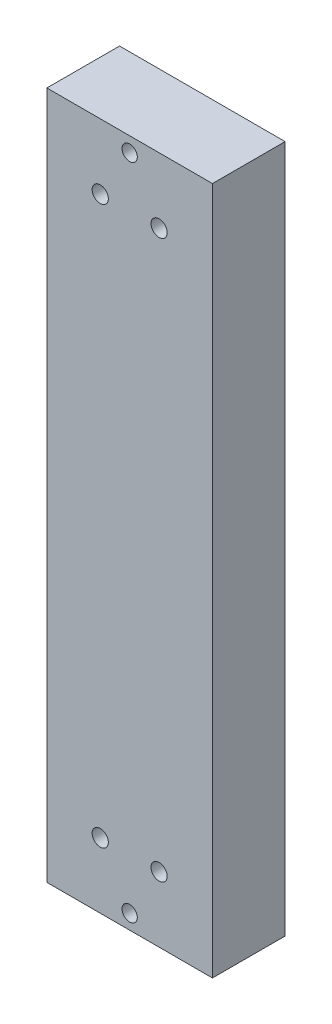
ISO-10303-21;
HEADER;
FILE_DESCRIPTION(('STEP AP214'),'2;1');
FILE_NAME('part.step','',(''),(''),'','','');
FILE_SCHEMA(('AUTOMOTIVE_DESIGN { 1 0 10303 214 1 1 1 1 }'));
ENDSEC;
DATA;
#1=APPLICATION_CONTEXT('core data for automotive mechanical design processes');
#2=APPLICATION_PROTOCOL_DEFINITION('international standard','automotive_design',2000,#1);
#3=PRODUCT_CONTEXT('',#1,'mechanical');
#4=PRODUCT('Part','Part','',(#3));
#5=PRODUCT_RELATED_PRODUCT_CATEGORY('part','',(#4));
#6=PRODUCT_DEFINITION_FORMATION('','',#4);
#7=PRODUCT_DEFINITION_CONTEXT('part definition',#1,'design');
#8=PRODUCT_DEFINITION('design','',#6,#7);
#9=PRODUCT_DEFINITION_SHAPE('','',#8);
#10=(LENGTH_UNIT() NAMED_UNIT(*) SI_UNIT(.MILLI.,.METRE.));
#11=(NAMED_UNIT(*) PLANE_ANGLE_UNIT() SI_UNIT($,.RADIAN.));
#12=(NAMED_UNIT(*) SI_UNIT($,.STERADIAN.) SOLID_ANGLE_UNIT());
#13=UNCERTAINTY_MEASURE_WITH_UNIT(LENGTH_MEASURE(1.E-05),#10,'distance_accuracy_value','');
#14=(GEOMETRIC_REPRESENTATION_CONTEXT(3) GLOBAL_UNCERTAINTY_ASSIGNED_CONTEXT((#13)) GLOBAL_UNIT_ASSIGNED_CONTEXT((#10,
#11,#12)) REPRESENTATION_CONTEXT('',''));
#15=CARTESIAN_POINT('',(0.,0.,0.));
#16=DIRECTION('',(0.,0.,1.));
#17=DIRECTION('',(1.,0.,0.));
#18=AXIS2_PLACEMENT_3D('',#15,#16,#17);
#19=CARTESIAN_POINT('',(0.,0.,0.));
#20=DIRECTION('',(0.,0.,1.));
#21=DIRECTION('',(1.,0.,0.));
#22=AXIS2_PLACEMENT_3D('',#19,#20,#21);
#23=PLANE('',#22);
#24=CARTESIAN_POINT('',(-2.92911864286199E-13,75.75,0.));
#25=DIRECTION('',(0.,0.,1.));
#26=DIRECTION('',(1.,0.,0.));
#27=AXIS2_PLACEMENT_3D('',#24,#25,#26);
#28=CIRCLE('',#27,2.19999999999999);
#29=CARTESIAN_POINT('',(2.1999999999997,75.75,0.));
#30=VERTEX_POINT('',#29);
#31=EDGE_CURVE('E294',#30,#30,#28,.T.);
#32=ORIENTED_EDGE('',*,*,#31,.T.);
#33=EDGE_LOOP('',(#32));
#34=FACE_BOUND('',#33,.T.);
#35=CARTESIAN_POINT('',(-2.75902098228347E-13,-75.75,0.));
#36=DIRECTION('',(0.,0.,1.));
#37=DIRECTION('',(1.,0.,0.));
#38=AXIS2_PLACEMENT_3D('',#35,#36,#37);
#39=CIRCLE('',#38,2.19999999999999);
#40=CARTESIAN_POINT('',(2.19999999999972,-75.75,0.));
#41=VERTEX_POINT('',#40);
#42=EDGE_CURVE('E282',#41,#41,#39,.T.);
#43=ORIENTED_EDGE('',*,*,#42,.T.);
#44=EDGE_LOOP('',(#43));
#45=FACE_BOUND('',#44,.T.);
#46=DIRECTION('',(1.,0.,0.));
#47=VECTOR('',#46,1.);
#48=CARTESIAN_POINT('',(0.,-85.5,0.));
#49=LINE('',#48,#47);
#50=CARTESIAN_POINT('',(-12.5,-85.5,0.));
#51=VERTEX_POINT('',#50);
#52=CARTESIAN_POINT('',(6.50000000000001,-85.5,0.));
#53=VERTEX_POINT('',#52);
#54=EDGE_CURVE('E140',#51,#53,#49,.T.);
#55=ORIENTED_EDGE('',*,*,#54,.F.);
#56=DIRECTION('',(0.,1.,0.));
#57=VECTOR('',#56,1.);
#58=CARTESIAN_POINT('',(-12.5,0.,0.));
#59=LINE('',#58,#57);
#60=CARTESIAN_POINT('',(-12.5,85.5,0.));
#61=VERTEX_POINT('',#60);
#62=EDGE_CURVE('E145',#51,#61,#59,.T.);
#63=ORIENTED_EDGE('',*,*,#62,.T.);
#64=DIRECTION('',(1.,0.,0.));
#65=VECTOR('',#64,1.);
#66=CARTESIAN_POINT('',(0.,85.5,0.));
#67=LINE('',#66,#65);
#68=CARTESIAN_POINT('',(6.50000000000001,85.5,0.));
#69=VERTEX_POINT('',#68);
#70=EDGE_CURVE('E245',#61,#69,#67,.T.);
#71=ORIENTED_EDGE('',*,*,#70,.T.);
#72=DIRECTION('',(0.,1.,0.));
#73=VECTOR('',#72,1.);
#74=CARTESIAN_POINT('',(6.50000000000001,0.,0.));
#75=LINE('',#74,#73);
#76=EDGE_CURVE('E223',#53,#69,#75,.T.);
#77=ORIENTED_EDGE('',*,*,#76,.F.);
#78=EDGE_LOOP('',(#55,#63,#71,#77));
#79=FACE_BOUND('',#78,.T.);
#80=ADVANCED_FACE('F125',(#34,#45,#79),#23,.F.);
#81=CARTESIAN_POINT('',(0.,0.,4.75));
#82=DIRECTION('',(0.,0.,1.));
#83=DIRECTION('',(1.,0.,0.));
#84=AXIS2_PLACEMENT_3D('',#81,#82,#83);
#85=PLANE('',#84);
#86=CARTESIAN_POINT('',(15.9999999999997,-75.75,4.75));
#87=DIRECTION('',(0.,0.,1.));
#88=DIRECTION('',(1.,0.,0.));
#89=AXIS2_PLACEMENT_3D('',#86,#87,#88);
#90=CIRCLE('',#89,2.2);
#91=CARTESIAN_POINT('',(18.1999999999997,-75.75,4.75));
#92=VERTEX_POINT('',#91);
#93=EDGE_CURVE('E279',#92,#92,#90,.T.);
#94=ORIENTED_EDGE('',*,*,#93,.F.);
#95=EDGE_LOOP('',(#94));
#96=FACE_BOUND('',#95,.T.);
#97=CARTESIAN_POINT('',(15.9999999999997,75.75,4.75));
#98=DIRECTION('',(0.,0.,1.));
#99=DIRECTION('',(1.,0.,0.));
#100=AXIS2_PLACEMENT_3D('',#97,#98,#99);
#101=CIRCLE('',#100,2.2);
#102=CARTESIAN_POINT('',(18.1999999999997,75.75,4.75));
#103=VERTEX_POINT('',#102);
#104=EDGE_CURVE('E291',#103,#103,#101,.T.);
#105=ORIENTED_EDGE('',*,*,#104,.F.);
#106=EDGE_LOOP('',(#105));
#107=FACE_BOUND('',#106,.T.);
#108=DIRECTION('',(1.,0.,0.));
#109=VECTOR('',#108,1.);
#110=CARTESIAN_POINT('',(-14.5,-93.5,4.75));
#111=LINE('',#110,#109);
#112=CARTESIAN_POINT('',(-14.5,-93.5,4.75));
#113=VERTEX_POINT('',#112);
#114=CARTESIAN_POINT('',(30.5,-93.5,4.75));
#115=VERTEX_POINT('',#114);
#116=EDGE_CURVE('E300',#113,#115,#111,.T.);
#117=ORIENTED_EDGE('',*,*,#116,.T.);
#118=DIRECTION('',(0.,1.,0.));
#119=VECTOR('',#118,1.);
#120=CARTESIAN_POINT('',(30.5,-93.5,4.75));
#121=LINE('',#120,#119);
#122=CARTESIAN_POINT('',(30.5,93.5,4.75));
#123=VERTEX_POINT('',#122);
#124=EDGE_CURVE('E305',#115,#123,#121,.T.);
#125=ORIENTED_EDGE('',*,*,#124,.T.);
#126=DIRECTION('',(1.,0.,0.));
#127=VECTOR('',#126,1.);
#128=CARTESIAN_POINT('',(-14.5,93.5,4.75));
#129=LINE('',#128,#127);
#130=CARTESIAN_POINT('',(-14.5,93.5,4.75));
#131=VERTEX_POINT('',#130);
#132=EDGE_CURVE('E307',#131,#123,#129,.T.);
#133=ORIENTED_EDGE('',*,*,#132,.F.);
#134=DIRECTION('',(0.,1.,0.));
#135=VECTOR('',#134,1.);
#136=CARTESIAN_POINT('',(-14.5,-93.5,4.75));
#137=LINE('',#136,#135);
#138=EDGE_CURVE('E310',#113,#131,#137,.T.);
#139=ORIENTED_EDGE('',*,*,#138,.F.);
#140=EDGE_LOOP('',(#117,#125,#133,#139));
#141=FACE_BOUND('',#140,.T.);
#142=CARTESIAN_POINT('',(-2.92911864286199E-13,75.75,4.75));
#143=DIRECTION('',(0.,0.,1.));
#144=DIRECTION('',(1.,0.,0.));
#145=AXIS2_PLACEMENT_3D('',#142,#143,#144);
#146=CIRCLE('',#145,2.19999999999999);
#147=CARTESIAN_POINT('',(2.1999999999997,75.75,4.75));
#148=VERTEX_POINT('',#147);
#149=EDGE_CURVE('E297',#148,#148,#146,.T.);
#150=ORIENTED_EDGE('',*,*,#149,.F.);
#151=EDGE_LOOP('',(#150));
#152=FACE_BOUND('',#151,.T.);
#153=CARTESIAN_POINT('',(-2.75902098228347E-13,-75.75,4.75));
#154=DIRECTION('',(0.,0.,1.));
#155=DIRECTION('',(1.,0.,0.));
#156=AXIS2_PLACEMENT_3D('',#153,#154,#155);
#157=CIRCLE('',#156,2.19999999999999);
#158=CARTESIAN_POINT('',(2.19999999999972,-75.75,4.75));
#159=VERTEX_POINT('',#158);
#160=EDGE_CURVE('E285',#159,#159,#157,.T.);
#161=ORIENTED_EDGE('',*,*,#160,.F.);
#162=EDGE_LOOP('',(#161));
#163=FACE_BOUND('',#162,.T.);
#164=CARTESIAN_POINT('',(7.99999999999997,89.5,4.75));
#165=DIRECTION('',(0.,0.,-1.));
#166=DIRECTION('',(-1.,0.,0.));
#167=AXIS2_PLACEMENT_3D('',#164,#165,#166);
#168=CIRCLE('',#167,2.075);
#169=CARTESIAN_POINT('',(5.92499999999998,89.5,4.75));
#170=VERTEX_POINT('',#169);
#171=EDGE_CURVE('E275',#170,#170,#168,.T.);
#172=ORIENTED_EDGE('',*,*,#171,.T.);
#173=EDGE_LOOP('',(#172));
#174=FACE_BOUND('',#173,.T.);
#175=CARTESIAN_POINT('',(8.,-89.5,4.75));
#176=DIRECTION('',(0.,0.,1.));
#177=DIRECTION('',(1.,0.,0.));
#178=AXIS2_PLACEMENT_3D('',#175,#176,#177);
#179=CIRCLE('',#178,2.075);
#180=CARTESIAN_POINT('',(10.075,-89.5,4.75));
#181=VERTEX_POINT('',#180);
#182=EDGE_CURVE('E271',#181,#181,#179,.T.);
#183=ORIENTED_EDGE('',*,*,#182,.F.);
#184=EDGE_LOOP('',(#183));
#185=FACE_BOUND('',#184,.T.);
#186=ADVANCED_FACE('F380',(#96,#107,#141,#152,#163,#174,#185),#85,.T.);
#187=CARTESIAN_POINT('',(9.5,-85.5,0.));
#188=VERTEX_POINT('',#187);
#189=CARTESIAN_POINT('',(28.5,-85.5,0.));
#190=VERTEX_POINT('',#189);
#191=EDGE_CURVE('E216',#188,#190,#49,.T.);
#192=ORIENTED_EDGE('',*,*,#191,.F.);
#193=DIRECTION('',(0.,1.,0.));
#194=VECTOR('',#193,1.);
#195=CARTESIAN_POINT('',(9.5,0.,0.));
#196=LINE('',#195,#194);
#197=CARTESIAN_POINT('',(9.5,85.5,0.));
#198=VERTEX_POINT('',#197);
#199=EDGE_CURVE('E239',#188,#198,#196,.T.);
#200=ORIENTED_EDGE('',*,*,#199,.T.);
#201=CARTESIAN_POINT('',(28.5,85.5,0.));
#202=VERTEX_POINT('',#201);
#203=EDGE_CURVE('E219',#198,#202,#67,.T.);
#204=ORIENTED_EDGE('',*,*,#203,.T.);
#205=DIRECTION('',(0.,1.,0.));
#206=VECTOR('',#205,1.);
#207=CARTESIAN_POINT('',(28.5,0.,0.));
#208=LINE('',#207,#206);
#209=EDGE_CURVE('E211',#190,#202,#208,.T.);
#210=ORIENTED_EDGE('',*,*,#209,.F.);
#211=EDGE_LOOP('',(#192,#200,#204,#210));
#212=FACE_BOUND('',#211,.T.);
#213=CARTESIAN_POINT('',(15.9999999999997,75.75,0.));
#214=DIRECTION('',(0.,0.,1.));
#215=DIRECTION('',(1.,0.,0.));
#216=AXIS2_PLACEMENT_3D('',#213,#214,#215);
#217=CIRCLE('',#216,2.2);
#218=CARTESIAN_POINT('',(18.1999999999997,75.75,0.));
#219=VERTEX_POINT('',#218);
#220=EDGE_CURVE('E288',#219,#219,#217,.T.);
#221=ORIENTED_EDGE('',*,*,#220,.T.);
#222=EDGE_LOOP('',(#221));
#223=FACE_BOUND('',#222,.T.);
#224=CARTESIAN_POINT('',(15.9999999999997,-75.75,0.));
#225=DIRECTION('',(0.,0.,1.));
#226=DIRECTION('',(1.,0.,0.));
#227=AXIS2_PLACEMENT_3D('',#224,#225,#226);
#228=CIRCLE('',#227,2.2);
#229=CARTESIAN_POINT('',(18.1999999999997,-75.75,0.));
#230=VERTEX_POINT('',#229);
#231=EDGE_CURVE('E278',#230,#230,#228,.T.);
#232=ORIENTED_EDGE('',*,*,#231,.T.);
#233=EDGE_LOOP('',(#232));
#234=FACE_BOUND('',#233,.T.);
#235=ADVANCED_FACE('F213',(#212,#223,#234),#23,.F.);
#236=CARTESIAN_POINT('',(-14.5,-93.5,4.75));
#237=DIRECTION('',(0.,1.,0.));
#238=DIRECTION('',(-1.,0.,0.));
#239=AXIS2_PLACEMENT_3D('',#236,#237,#238);
#240=PLANE('',#239);
#241=DIRECTION('',(0.,0.,-1.));
#242=VECTOR('',#241,1.);
#243=CARTESIAN_POINT('',(-14.5,-93.5,4.75));
#244=LINE('',#243,#242);
#245=CARTESIAN_POINT('',(-14.5,-93.5,-15.));
#246=VERTEX_POINT('',#245);
#247=EDGE_CURVE('E313',#113,#246,#244,.T.);
#248=ORIENTED_EDGE('',*,*,#247,.T.);
#249=DIRECTION('',(-1.,0.,0.));
#250=VECTOR('',#249,1.);
#251=CARTESIAN_POINT('',(0.,-93.5,-15.));
#252=LINE('',#251,#250);
#253=CARTESIAN_POINT('',(30.5,-93.5,-15.));
#254=VERTEX_POINT('',#253);
#255=EDGE_CURVE('E346',#254,#246,#252,.T.);
#256=ORIENTED_EDGE('',*,*,#255,.F.);
#257=DIRECTION('',(0.,0.,-1.));
#258=VECTOR('',#257,1.);
#259=CARTESIAN_POINT('',(30.5,-93.5,4.75));
#260=LINE('',#259,#258);
#261=EDGE_CURVE('E12',#115,#254,#260,.T.);
#262=ORIENTED_EDGE('',*,*,#261,.F.);
#263=ORIENTED_EDGE('',*,*,#116,.F.);
#264=EDGE_LOOP('',(#248,#256,#262,#263));
#265=FACE_BOUND('',#264,.T.);
#266=ADVANCED_FACE('F127',(#265),#240,.F.);
#267=CARTESIAN_POINT('',(30.5,-93.5,4.75));
#268=DIRECTION('',(-1.,0.,0.));
#269=DIRECTION('',(0.,-1.,0.));
#270=AXIS2_PLACEMENT_3D('',#267,#268,#269);
#271=PLANE('',#270);
#272=ORIENTED_EDGE('',*,*,#261,.T.);
#273=DIRECTION('',(0.,-1.,0.));
#274=VECTOR('',#273,1.);
#275=CARTESIAN_POINT('',(30.5,0.,-15.));
#276=LINE('',#275,#274);
#277=CARTESIAN_POINT('',(30.5,93.5,-15.));
#278=VERTEX_POINT('',#277);
#279=EDGE_CURVE('E331',#278,#254,#276,.T.);
#280=ORIENTED_EDGE('',*,*,#279,.F.);
#281=DIRECTION('',(0.,0.,-1.));
#282=VECTOR('',#281,1.);
#283=CARTESIAN_POINT('',(30.5,93.5,4.75));
#284=LINE('',#283,#282);
#285=EDGE_CURVE('E133',#123,#278,#284,.T.);
#286=ORIENTED_EDGE('',*,*,#285,.F.);
#287=ORIENTED_EDGE('',*,*,#124,.F.);
#288=EDGE_LOOP('',(#272,#280,#286,#287));
#289=FACE_BOUND('',#288,.T.);
#290=ADVANCED_FACE('F336',(#289),#271,.F.);
#291=CARTESIAN_POINT('',(-14.5,93.5,4.75));
#292=DIRECTION('',(0.,1.,0.));
#293=DIRECTION('',(-1.,0.,0.));
#294=AXIS2_PLACEMENT_3D('',#291,#292,#293);
#295=PLANE('',#294);
#296=ORIENTED_EDGE('',*,*,#285,.T.);
#297=DIRECTION('',(-1.,0.,0.));
#298=VECTOR('',#297,1.);
#299=CARTESIAN_POINT('',(0.,93.5,-15.));
#300=LINE('',#299,#298);
#301=CARTESIAN_POINT('',(-14.5,93.5,-15.));
#302=VERTEX_POINT('',#301);
#303=EDGE_CURVE('E321',#278,#302,#300,.T.);
#304=ORIENTED_EDGE('',*,*,#303,.T.);
#305=DIRECTION('',(0.,0.,-1.));
#306=VECTOR('',#305,1.);
#307=CARTESIAN_POINT('',(-14.5,93.5,4.75));
#308=LINE('',#307,#306);
#309=EDGE_CURVE('E315',#131,#302,#308,.T.);
#310=ORIENTED_EDGE('',*,*,#309,.F.);
#311=ORIENTED_EDGE('',*,*,#132,.T.);
#312=EDGE_LOOP('',(#296,#304,#310,#311));
#313=FACE_BOUND('',#312,.T.);
#314=ADVANCED_FACE('F320',(#313),#295,.T.);
#315=CARTESIAN_POINT('',(-14.5,-93.5,4.75));
#316=DIRECTION('',(-1.,0.,0.));
#317=DIRECTION('',(0.,-1.,0.));
#318=AXIS2_PLACEMENT_3D('',#315,#316,#317);
#319=PLANE('',#318);
#320=ORIENTED_EDGE('',*,*,#309,.T.);
#321=DIRECTION('',(0.,-1.,0.));
#322=VECTOR('',#321,1.);
#323=CARTESIAN_POINT('',(-14.5,0.,-15.));
#324=LINE('',#323,#322);
#325=EDGE_CURVE('E334',#302,#246,#324,.T.);
#326=ORIENTED_EDGE('',*,*,#325,.T.);
#327=ORIENTED_EDGE('',*,*,#247,.F.);
#328=ORIENTED_EDGE('',*,*,#138,.T.);
#329=EDGE_LOOP('',(#320,#326,#327,#328));
#330=FACE_BOUND('',#329,.T.);
#331=ADVANCED_FACE('F401',(#330),#319,.T.);
#332=CARTESIAN_POINT('',(-2.92911864286199E-13,75.75,4.75));
#333=DIRECTION('',(0.,0.,-1.));
#334=DIRECTION('',(-1.,0.,0.));
#335=AXIS2_PLACEMENT_3D('',#332,#333,#334);
#336=CYLINDRICAL_SURFACE('',#335,2.19999999999999);
#337=ORIENTED_EDGE('',*,*,#149,.T.);
#338=EDGE_LOOP('',(#337));
#339=FACE_BOUND('',#338,.T.);
#340=ORIENTED_EDGE('',*,*,#31,.F.);
#341=EDGE_LOOP('',(#340));
#342=FACE_BOUND('',#341,.T.);
#343=ADVANCED_FACE('F475',(#339,#342),#336,.F.);
#344=CARTESIAN_POINT('',(15.9999999999997,75.75,4.75));
#345=DIRECTION('',(0.,0.,-1.));
#346=DIRECTION('',(-1.,0.,0.));
#347=AXIS2_PLACEMENT_3D('',#344,#345,#346);
#348=CYLINDRICAL_SURFACE('',#347,2.2);
#349=ORIENTED_EDGE('',*,*,#104,.T.);
#350=EDGE_LOOP('',(#349));
#351=FACE_BOUND('',#350,.T.);
#352=ORIENTED_EDGE('',*,*,#220,.F.);
#353=EDGE_LOOP('',(#352));
#354=FACE_BOUND('',#353,.T.);
#355=ADVANCED_FACE('F522',(#351,#354),#348,.F.);
#356=CARTESIAN_POINT('',(-2.75902098228347E-13,-75.75,4.75));
#357=DIRECTION('',(0.,0.,-1.));
#358=DIRECTION('',(-1.,0.,0.));
#359=AXIS2_PLACEMENT_3D('',#356,#357,#358);
#360=CYLINDRICAL_SURFACE('',#359,2.19999999999999);
#361=ORIENTED_EDGE('',*,*,#160,.T.);
#362=EDGE_LOOP('',(#361));
#363=FACE_BOUND('',#362,.T.);
#364=ORIENTED_EDGE('',*,*,#42,.F.);
#365=EDGE_LOOP('',(#364));
#366=FACE_BOUND('',#365,.T.);
#367=ADVANCED_FACE('F375',(#363,#366),#360,.F.);
#368=CARTESIAN_POINT('',(15.9999999999997,-75.75,4.75));
#369=DIRECTION('',(0.,0.,-1.));
#370=DIRECTION('',(-1.,0.,0.));
#371=AXIS2_PLACEMENT_3D('',#368,#369,#370);
#372=CYLINDRICAL_SURFACE('',#371,2.2);
#373=ORIENTED_EDGE('',*,*,#93,.T.);
#374=EDGE_LOOP('',(#373));
#375=FACE_BOUND('',#374,.T.);
#376=ORIENTED_EDGE('',*,*,#231,.F.);
#377=EDGE_LOOP('',(#376));
#378=FACE_BOUND('',#377,.T.);
#379=ADVANCED_FACE('F365',(#375,#378),#372,.F.);
#380=CARTESIAN_POINT('',(7.99999999999997,89.5,4.75));
#381=DIRECTION('',(0.,0.,-1.));
#382=DIRECTION('',(-1.,0.,0.));
#383=AXIS2_PLACEMENT_3D('',#380,#381,#382);
#384=CYLINDRICAL_SURFACE('',#383,2.075);
#385=ORIENTED_EDGE('',*,*,#171,.F.);
#386=EDGE_LOOP('',(#385));
#387=FACE_BOUND('',#386,.T.);
#388=CARTESIAN_POINT('',(7.99999999999997,89.5,-15.));
#389=DIRECTION('',(0.,0.,1.));
#390=DIRECTION('',(0.,-1.,0.));
#391=AXIS2_PLACEMENT_3D('',#388,#389,#390);
#392=CIRCLE('',#391,2.075);
#393=CARTESIAN_POINT('',(7.99999999999997,87.425,-15.));
#394=VERTEX_POINT('',#393);
#395=EDGE_CURVE('E272',#394,#394,#392,.T.);
#396=ORIENTED_EDGE('',*,*,#395,.F.);
#397=EDGE_LOOP('',(#396));
#398=FACE_BOUND('',#397,.T.);
#399=ADVANCED_FACE('F362',(#387,#398),#384,.F.);
#400=CARTESIAN_POINT('',(8.,-89.5,4.75));
#401=DIRECTION('',(0.,0.,-1.));
#402=DIRECTION('',(-1.,0.,0.));
#403=AXIS2_PLACEMENT_3D('',#400,#401,#402);
#404=CYLINDRICAL_SURFACE('',#403,2.075);
#405=ORIENTED_EDGE('',*,*,#182,.T.);
#406=EDGE_LOOP('',(#405));
#407=FACE_BOUND('',#406,.T.);
#408=CARTESIAN_POINT('',(8.,-89.5,-15.));
#409=DIRECTION('',(0.,0.,1.));
#410=DIRECTION('',(0.,-1.,0.));
#411=AXIS2_PLACEMENT_3D('',#408,#409,#410);
#412=CIRCLE('',#411,2.075);
#413=CARTESIAN_POINT('',(8.,-91.575,-15.));
#414=VERTEX_POINT('',#413);
#415=EDGE_CURVE('E268',#414,#414,#412,.F.);
#416=ORIENTED_EDGE('',*,*,#415,.T.);
#417=EDGE_LOOP('',(#416));
#418=FACE_BOUND('',#417,.T.);
#419=ADVANCED_FACE('F364',(#407,#418),#404,.F.);
#420=CARTESIAN_POINT('',(0.,-85.5,-209.338243727034));
#421=DIRECTION('',(0.,-1.,0.));
#422=DIRECTION('',(0.,0.,-1.));
#423=AXIS2_PLACEMENT_3D('',#420,#421,#422);
#424=PLANE('',#423);
#425=DIRECTION('',(0.,0.,1.));
#426=VECTOR('',#425,1.);
#427=CARTESIAN_POINT('',(6.50000000000001,-85.5,-209.338243727034));
#428=LINE('',#427,#426);
#429=CARTESIAN_POINT('',(6.50000000000001,-85.5,-15.));
#430=VERTEX_POINT('',#429);
#431=EDGE_CURVE('E232',#430,#53,#428,.T.);
#432=ORIENTED_EDGE('',*,*,#431,.F.);
#433=DIRECTION('',(-1.,0.,0.));
#434=VECTOR('',#433,1.);
#435=CARTESIAN_POINT('',(0.,-85.5,-15.));
#436=LINE('',#435,#434);
#437=CARTESIAN_POINT('',(-12.5,-85.5,-15.));
#438=VERTEX_POINT('',#437);
#439=EDGE_CURVE('E257',#430,#438,#436,.T.);
#440=ORIENTED_EDGE('',*,*,#439,.T.);
#441=DIRECTION('',(0.,0.,1.));
#442=VECTOR('',#441,1.);
#443=CARTESIAN_POINT('',(-12.5,-85.5,-209.338243727034));
#444=LINE('',#443,#442);
#445=EDGE_CURVE('E260',#438,#51,#444,.T.);
#446=ORIENTED_EDGE('',*,*,#445,.T.);
#447=ORIENTED_EDGE('',*,*,#54,.T.);
#448=EDGE_LOOP('',(#432,#440,#446,#447));
#449=FACE_BOUND('',#448,.T.);
#450=ADVANCED_FACE('F372',(#449),#424,.F.);
#451=CARTESIAN_POINT('',(-12.5,0.,-209.338243727034));
#452=DIRECTION('',(1.,0.,0.));
#453=DIRECTION('',(0.,0.,-1.));
#454=AXIS2_PLACEMENT_3D('',#451,#452,#453);
#455=PLANE('',#454);
#456=DIRECTION('',(0.,-1.,0.));
#457=VECTOR('',#456,1.);
#458=CARTESIAN_POINT('',(-12.5,0.,-15.));
#459=LINE('',#458,#457);
#460=CARTESIAN_POINT('',(-12.5,85.5,-15.));
#461=VERTEX_POINT('',#460);
#462=EDGE_CURVE('E341',#461,#438,#459,.T.);
#463=ORIENTED_EDGE('',*,*,#462,.F.);
#464=DIRECTION('',(0.,0.,1.));
#465=VECTOR('',#464,1.);
#466=CARTESIAN_POINT('',(-12.5,85.5,-209.338243727034));
#467=LINE('',#466,#465);
#468=EDGE_CURVE('E258',#461,#61,#467,.T.);
#469=ORIENTED_EDGE('',*,*,#468,.T.);
#470=ORIENTED_EDGE('',*,*,#62,.F.);
#471=ORIENTED_EDGE('',*,*,#445,.F.);
#472=EDGE_LOOP('',(#463,#469,#470,#471));
#473=FACE_BOUND('',#472,.T.);
#474=ADVANCED_FACE('F425',(#473),#455,.T.);
#475=CARTESIAN_POINT('',(0.,85.5,-209.338243727034));
#476=DIRECTION('',(0.,-1.,0.));
#477=DIRECTION('',(0.,0.,-1.));
#478=AXIS2_PLACEMENT_3D('',#475,#476,#477);
#479=PLANE('',#478);
#480=DIRECTION('',(-1.,0.,0.));
#481=VECTOR('',#480,1.);
#482=CARTESIAN_POINT('',(0.,85.5,-15.));
#483=LINE('',#482,#481);
#484=CARTESIAN_POINT('',(6.50000000000001,85.5,-15.));
#485=VERTEX_POINT('',#484);
#486=EDGE_CURVE('E354',#485,#461,#483,.T.);
#487=ORIENTED_EDGE('',*,*,#486,.F.);
#488=DIRECTION('',(0.,0.,1.));
#489=VECTOR('',#488,1.);
#490=CARTESIAN_POINT('',(6.50000000000001,85.5,-209.338243727034));
#491=LINE('',#490,#489);
#492=EDGE_CURVE('E254',#485,#69,#491,.T.);
#493=ORIENTED_EDGE('',*,*,#492,.T.);
#494=ORIENTED_EDGE('',*,*,#70,.F.);
#495=ORIENTED_EDGE('',*,*,#468,.F.);
#496=EDGE_LOOP('',(#487,#493,#494,#495));
#497=FACE_BOUND('',#496,.T.);
#498=ADVANCED_FACE('F423',(#497),#479,.T.);
#499=CARTESIAN_POINT('',(6.50000000000001,0.,-209.338243727034));
#500=DIRECTION('',(1.,0.,0.));
#501=DIRECTION('',(0.,0.,-1.));
#502=AXIS2_PLACEMENT_3D('',#499,#500,#501);
#503=PLANE('',#502);
#504=ORIENTED_EDGE('',*,*,#492,.F.);
#505=DIRECTION('',(0.,-1.,0.));
#506=VECTOR('',#505,1.);
#507=CARTESIAN_POINT('',(6.50000000000001,0.,-15.));
#508=LINE('',#507,#506);
#509=EDGE_CURVE('E356',#485,#430,#508,.T.);
#510=ORIENTED_EDGE('',*,*,#509,.T.);
#511=ORIENTED_EDGE('',*,*,#431,.T.);
#512=ORIENTED_EDGE('',*,*,#76,.T.);
#513=EDGE_LOOP('',(#504,#510,#511,#512));
#514=FACE_BOUND('',#513,.T.);
#515=ADVANCED_FACE('F426',(#514),#503,.F.);
#516=CARTESIAN_POINT('',(9.5,0.,-209.338243727034));
#517=DIRECTION('',(1.,0.,0.));
#518=DIRECTION('',(0.,0.,-1.));
#519=AXIS2_PLACEMENT_3D('',#516,#517,#518);
#520=PLANE('',#519);
#521=DIRECTION('',(0.,-1.,0.));
#522=VECTOR('',#521,1.);
#523=CARTESIAN_POINT('',(9.5,0.,-15.));
#524=LINE('',#523,#522);
#525=CARTESIAN_POINT('',(9.5,85.5,-15.));
#526=VERTEX_POINT('',#525);
#527=CARTESIAN_POINT('',(9.5,-85.5,-15.));
#528=VERTEX_POINT('',#527);
#529=EDGE_CURVE('E338',#526,#528,#524,.T.);
#530=ORIENTED_EDGE('',*,*,#529,.F.);
#531=DIRECTION('',(0.,0.,1.));
#532=VECTOR('',#531,1.);
#533=CARTESIAN_POINT('',(9.5,85.5,-209.338243727034));
#534=LINE('',#533,#532);
#535=EDGE_CURVE('E264',#526,#198,#534,.T.);
#536=ORIENTED_EDGE('',*,*,#535,.T.);
#537=ORIENTED_EDGE('',*,*,#199,.F.);
#538=DIRECTION('',(0.,0.,1.));
#539=VECTOR('',#538,1.);
#540=CARTESIAN_POINT('',(9.5,-85.5,-209.338243727034));
#541=LINE('',#540,#539);
#542=EDGE_CURVE('E237',#528,#188,#541,.T.);
#543=ORIENTED_EDGE('',*,*,#542,.F.);
#544=EDGE_LOOP('',(#530,#536,#537,#543));
#545=FACE_BOUND('',#544,.T.);
#546=ADVANCED_FACE('F428',(#545),#520,.T.);
#547=DIRECTION('',(-1.,0.,0.));
#548=VECTOR('',#547,1.);
#549=CARTESIAN_POINT('',(0.,85.5,-15.));
#550=LINE('',#549,#548);
#551=CARTESIAN_POINT('',(28.5,85.5,-15.));
#552=VERTEX_POINT('',#551);
#553=EDGE_CURVE('E347',#552,#526,#550,.T.);
#554=ORIENTED_EDGE('',*,*,#553,.F.);
#555=DIRECTION('',(0.,0.,1.));
#556=VECTOR('',#555,1.);
#557=CARTESIAN_POINT('',(28.5,85.5,-209.338243727034));
#558=LINE('',#557,#556);
#559=EDGE_CURVE('E233',#552,#202,#558,.T.);
#560=ORIENTED_EDGE('',*,*,#559,.T.);
#561=ORIENTED_EDGE('',*,*,#203,.F.);
#562=ORIENTED_EDGE('',*,*,#535,.F.);
#563=EDGE_LOOP('',(#554,#560,#561,#562));
#564=FACE_BOUND('',#563,.T.);
#565=ADVANCED_FACE('F434',(#564),#479,.T.);
#566=CARTESIAN_POINT('',(28.5,0.,-209.338243727034));
#567=DIRECTION('',(1.,0.,0.));
#568=DIRECTION('',(0.,0.,-1.));
#569=AXIS2_PLACEMENT_3D('',#566,#567,#568);
#570=PLANE('',#569);
#571=ORIENTED_EDGE('',*,*,#559,.F.);
#572=DIRECTION('',(0.,-1.,0.));
#573=VECTOR('',#572,1.);
#574=CARTESIAN_POINT('',(28.5,0.,-15.));
#575=LINE('',#574,#573);
#576=CARTESIAN_POINT('',(28.5,-85.5,-15.));
#577=VERTEX_POINT('',#576);
#578=EDGE_CURVE('E229',#552,#577,#575,.T.);
#579=ORIENTED_EDGE('',*,*,#578,.T.);
#580=DIRECTION('',(0.,0.,1.));
#581=VECTOR('',#580,1.);
#582=CARTESIAN_POINT('',(28.5,-85.5,-209.338243727034));
#583=LINE('',#582,#581);
#584=EDGE_CURVE('E227',#577,#190,#583,.T.);
#585=ORIENTED_EDGE('',*,*,#584,.T.);
#586=ORIENTED_EDGE('',*,*,#209,.T.);
#587=EDGE_LOOP('',(#571,#579,#585,#586));
#588=FACE_BOUND('',#587,.T.);
#589=ADVANCED_FACE('F228',(#588),#570,.F.);
#590=ORIENTED_EDGE('',*,*,#584,.F.);
#591=DIRECTION('',(-1.,0.,0.));
#592=VECTOR('',#591,1.);
#593=CARTESIAN_POINT('',(0.,-85.5,-15.));
#594=LINE('',#593,#592);
#595=EDGE_CURVE('E339',#577,#528,#594,.T.);
#596=ORIENTED_EDGE('',*,*,#595,.T.);
#597=ORIENTED_EDGE('',*,*,#542,.T.);
#598=ORIENTED_EDGE('',*,*,#191,.T.);
#599=EDGE_LOOP('',(#590,#596,#597,#598));
#600=FACE_BOUND('',#599,.T.);
#601=ADVANCED_FACE('F235',(#600),#424,.F.);
#602=CARTESIAN_POINT('',(0.,-84.5,-15.));
#603=DIRECTION('',(0.,0.,1.));
#604=DIRECTION('',(0.,-1.,0.));
#605=AXIS2_PLACEMENT_3D('',#602,#603,#604);
#606=PLANE('',#605);
#607=ORIENTED_EDGE('',*,*,#395,.T.);
#608=EDGE_LOOP('',(#607));
#609=FACE_BOUND('',#608,.T.);
#610=ORIENTED_EDGE('',*,*,#255,.T.);
#611=ORIENTED_EDGE('',*,*,#325,.F.);
#612=ORIENTED_EDGE('',*,*,#303,.F.);
#613=ORIENTED_EDGE('',*,*,#279,.T.);
#614=EDGE_LOOP('',(#610,#611,#612,#613));
#615=FACE_BOUND('',#614,.T.);
#616=ORIENTED_EDGE('',*,*,#415,.F.);
#617=EDGE_LOOP('',(#616));
#618=FACE_BOUND('',#617,.T.);
#619=ORIENTED_EDGE('',*,*,#578,.F.);
#620=ORIENTED_EDGE('',*,*,#553,.T.);
#621=ORIENTED_EDGE('',*,*,#529,.T.);
#622=ORIENTED_EDGE('',*,*,#595,.F.);
#623=EDGE_LOOP('',(#619,#620,#621,#622));
#624=FACE_BOUND('',#623,.T.);
#625=ORIENTED_EDGE('',*,*,#486,.T.);
#626=ORIENTED_EDGE('',*,*,#462,.T.);
#627=ORIENTED_EDGE('',*,*,#439,.F.);
#628=ORIENTED_EDGE('',*,*,#509,.F.);
#629=EDGE_LOOP('',(#625,#626,#627,#628));
#630=FACE_BOUND('',#629,.T.);
#631=ADVANCED_FACE('F329',(#609,#615,#618,#624,#630),#606,.F.);
#632=CLOSED_SHELL('',(#80,#186,#235,#266,#290,#314,#331,#343,#355,#367,#379,#399,#419,#450,#474,
#498,#515,#546,#565,#589,#601,#631));
#633=MANIFOLD_SOLID_BREP('B2',#632);
#634=ADVANCED_BREP_SHAPE_REPRESENTATION('',(#18,#633),#14);
#635=SHAPE_DEFINITION_REPRESENTATION(#9,#634);
ENDSEC;
END-ISO-10303-21;
